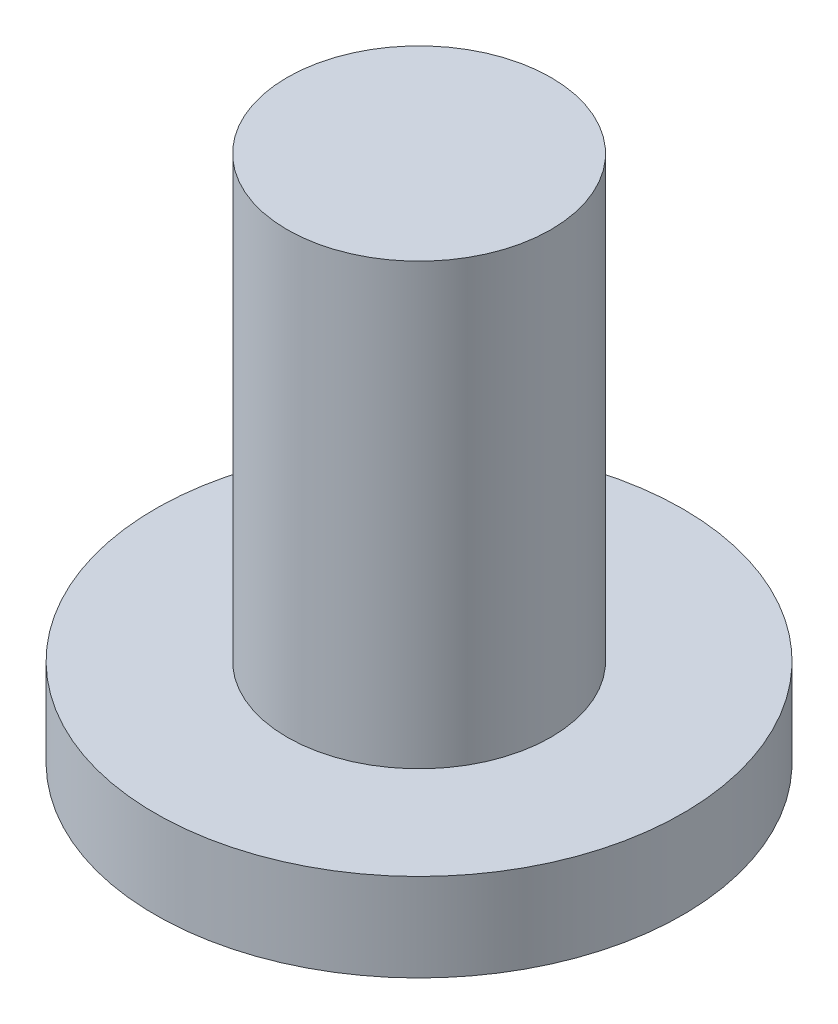
ISO-10303-21;
HEADER;
FILE_DESCRIPTION(('STEP AP214'),'2;1');
FILE_NAME('part.step','',(''),(''),'','','');
FILE_SCHEMA(('AUTOMOTIVE_DESIGN { 1 0 10303 214 1 1 1 1 }'));
ENDSEC;
DATA;
#1=APPLICATION_CONTEXT('core data for automotive mechanical design processes');
#2=APPLICATION_PROTOCOL_DEFINITION('international standard','automotive_design',2000,#1);
#3=PRODUCT_CONTEXT('',#1,'mechanical');
#4=PRODUCT('Part','Part','',(#3));
#5=PRODUCT_RELATED_PRODUCT_CATEGORY('part','',(#4));
#6=PRODUCT_DEFINITION_FORMATION('','',#4);
#7=PRODUCT_DEFINITION_CONTEXT('part definition',#1,'design');
#8=PRODUCT_DEFINITION('design','',#6,#7);
#9=PRODUCT_DEFINITION_SHAPE('','',#8);
#10=(LENGTH_UNIT() NAMED_UNIT(*) SI_UNIT(.MILLI.,.METRE.));
#11=(NAMED_UNIT(*) PLANE_ANGLE_UNIT() SI_UNIT($,.RADIAN.));
#12=(NAMED_UNIT(*) SI_UNIT($,.STERADIAN.) SOLID_ANGLE_UNIT());
#13=UNCERTAINTY_MEASURE_WITH_UNIT(LENGTH_MEASURE(1.E-05),#10,'distance_accuracy_value','');
#14=(GEOMETRIC_REPRESENTATION_CONTEXT(3) GLOBAL_UNCERTAINTY_ASSIGNED_CONTEXT((#13)) GLOBAL_UNIT_ASSIGNED_CONTEXT((#10,
#11,#12)) REPRESENTATION_CONTEXT('',''));
#15=CARTESIAN_POINT('',(0.,0.,0.));
#16=DIRECTION('',(0.,0.,1.));
#17=DIRECTION('',(1.,0.,0.));
#18=AXIS2_PLACEMENT_3D('',#15,#16,#17);
#19=CARTESIAN_POINT('',(6.,0.,0.));
#20=DIRECTION('',(0.,-1.,0.));
#21=DIRECTION('',(0.,0.,-1.));
#22=AXIS2_PLACEMENT_3D('',#19,#20,#21);
#23=PLANE('',#22);
#24=CARTESIAN_POINT('',(0.,0.,0.));
#25=DIRECTION('',(0.,-1.,0.));
#26=DIRECTION('',(0.,0.,-1.));
#27=AXIS2_PLACEMENT_3D('',#24,#25,#26);
#28=CIRCLE('',#27,6.);
#29=CARTESIAN_POINT('',(0.,0.,-6.));
#30=VERTEX_POINT('',#29);
#31=EDGE_CURVE('E60',#30,#30,#28,.T.);
#32=ORIENTED_EDGE('',*,*,#31,.T.);
#33=EDGE_LOOP('',(#32));
#34=FACE_BOUND('',#33,.T.);
#35=ADVANCED_FACE('F43',(#34),#23,.T.);
#36=CARTESIAN_POINT('',(0.,12.,0.));
#37=DIRECTION('',(0.,1.,0.));
#38=DIRECTION('',(0.,0.,1.));
#39=AXIS2_PLACEMENT_3D('',#36,#37,#38);
#40=PLANE('',#39);
#41=CARTESIAN_POINT('',(0.,12.,0.));
#42=DIRECTION('',(0.,-1.,0.));
#43=DIRECTION('',(0.,0.,-1.));
#44=AXIS2_PLACEMENT_3D('',#41,#42,#43);
#45=CIRCLE('',#44,3.);
#46=CARTESIAN_POINT('',(0.,12.,-3.));
#47=VERTEX_POINT('',#46);
#48=EDGE_CURVE('E10',#47,#47,#45,.T.);
#49=ORIENTED_EDGE('',*,*,#48,.F.);
#50=EDGE_LOOP('',(#49));
#51=FACE_BOUND('',#50,.T.);
#52=ADVANCED_FACE('F79',(#51),#40,.T.);
#53=CARTESIAN_POINT('',(0.,0.,0.));
#54=DIRECTION('',(0.,-1.,0.));
#55=DIRECTION('',(0.,0.,-1.));
#56=AXIS2_PLACEMENT_3D('',#53,#54,#55);
#57=CYLINDRICAL_SURFACE('',#56,3.);
#58=ORIENTED_EDGE('',*,*,#48,.T.);
#59=EDGE_LOOP('',(#58));
#60=FACE_BOUND('',#59,.T.);
#61=CARTESIAN_POINT('',(0.,2.,0.));
#62=DIRECTION('',(0.,-1.,0.));
#63=DIRECTION('',(0.,0.,-1.));
#64=AXIS2_PLACEMENT_3D('',#61,#62,#63);
#65=CIRCLE('',#64,3.);
#66=CARTESIAN_POINT('',(0.,2.,-3.));
#67=VERTEX_POINT('',#66);
#68=EDGE_CURVE('E50',#67,#67,#65,.T.);
#69=ORIENTED_EDGE('',*,*,#68,.F.);
#70=EDGE_LOOP('',(#69));
#71=FACE_BOUND('',#70,.T.);
#72=ADVANCED_FACE('F76',(#60,#71),#57,.T.);
#73=CARTESIAN_POINT('',(3.,2.,0.));
#74=DIRECTION('',(0.,1.,0.));
#75=DIRECTION('',(0.,0.,1.));
#76=AXIS2_PLACEMENT_3D('',#73,#74,#75);
#77=PLANE('',#76);
#78=ORIENTED_EDGE('',*,*,#68,.T.);
#79=EDGE_LOOP('',(#78));
#80=FACE_BOUND('',#79,.T.);
#81=CARTESIAN_POINT('',(0.,2.,0.));
#82=DIRECTION('',(0.,-1.,0.));
#83=DIRECTION('',(0.,0.,-1.));
#84=AXIS2_PLACEMENT_3D('',#81,#82,#83);
#85=CIRCLE('',#84,6.);
#86=CARTESIAN_POINT('',(0.,2.,-6.));
#87=VERTEX_POINT('',#86);
#88=EDGE_CURVE('E55',#87,#87,#85,.T.);
#89=ORIENTED_EDGE('',*,*,#88,.F.);
#90=EDGE_LOOP('',(#89));
#91=FACE_BOUND('',#90,.T.);
#92=ADVANCED_FACE('F70',(#80,#91),#77,.T.);
#93=CARTESIAN_POINT('',(0.,0.,0.));
#94=DIRECTION('',(0.,-1.,0.));
#95=DIRECTION('',(0.,0.,-1.));
#96=AXIS2_PLACEMENT_3D('',#93,#94,#95);
#97=CYLINDRICAL_SURFACE('',#96,6.);
#98=ORIENTED_EDGE('',*,*,#88,.T.);
#99=EDGE_LOOP('',(#98));
#100=FACE_BOUND('',#99,.T.);
#101=ORIENTED_EDGE('',*,*,#31,.F.);
#102=EDGE_LOOP('',(#101));
#103=FACE_BOUND('',#102,.T.);
#104=ADVANCED_FACE('F68',(#100,#103),#97,.T.);
#105=CLOSED_SHELL('',(#35,#52,#72,#92,#104));
#106=MANIFOLD_SOLID_BREP('B2',#105);
#107=ADVANCED_BREP_SHAPE_REPRESENTATION('',(#18,#106),#14);
#108=SHAPE_DEFINITION_REPRESENTATION(#9,#107);
ENDSEC;
END-ISO-10303-21;
